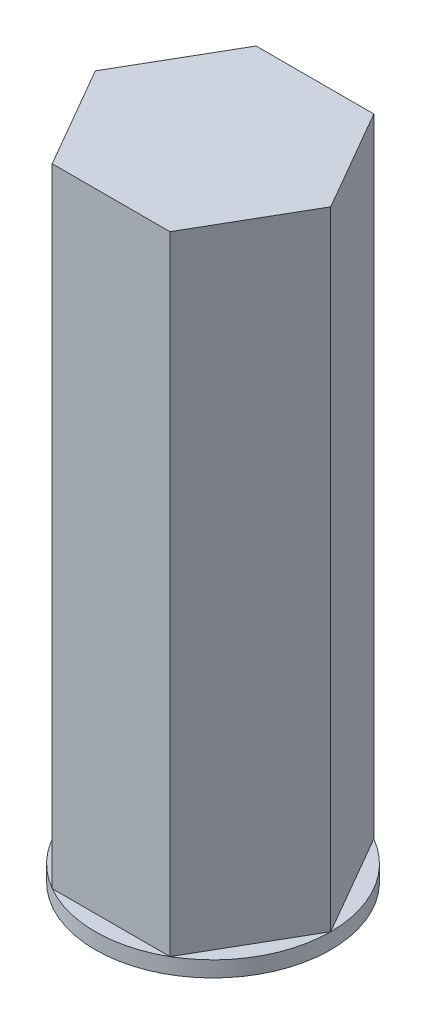
ISO-10303-21;
HEADER;
FILE_DESCRIPTION(('STEP AP214'),'2;1');
FILE_NAME('part.step','',(''),(''),'','','');
FILE_SCHEMA(('AUTOMOTIVE_DESIGN { 1 0 10303 214 1 1 1 1 }'));
ENDSEC;
DATA;
#1=APPLICATION_CONTEXT('core data for automotive mechanical design processes');
#2=APPLICATION_PROTOCOL_DEFINITION('international standard','automotive_design',2000,#1);
#3=PRODUCT_CONTEXT('',#1,'mechanical');
#4=PRODUCT('Part','Part','',(#3));
#5=PRODUCT_RELATED_PRODUCT_CATEGORY('part','',(#4));
#6=PRODUCT_DEFINITION_FORMATION('','',#4);
#7=PRODUCT_DEFINITION_CONTEXT('part definition',#1,'design');
#8=PRODUCT_DEFINITION('design','',#6,#7);
#9=PRODUCT_DEFINITION_SHAPE('','',#8);
#10=(LENGTH_UNIT() NAMED_UNIT(*) SI_UNIT(.MILLI.,.METRE.));
#11=(NAMED_UNIT(*) PLANE_ANGLE_UNIT() SI_UNIT($,.RADIAN.));
#12=(NAMED_UNIT(*) SI_UNIT($,.STERADIAN.) SOLID_ANGLE_UNIT());
#13=UNCERTAINTY_MEASURE_WITH_UNIT(LENGTH_MEASURE(1.E-05),#10,'distance_accuracy_value','');
#14=(GEOMETRIC_REPRESENTATION_CONTEXT(3) GLOBAL_UNCERTAINTY_ASSIGNED_CONTEXT((#13)) GLOBAL_UNIT_ASSIGNED_CONTEXT((#10,
#11,#12)) REPRESENTATION_CONTEXT('',''));
#15=CARTESIAN_POINT('',(0.,0.,0.));
#16=DIRECTION('',(0.,0.,1.));
#17=DIRECTION('',(1.,0.,0.));
#18=AXIS2_PLACEMENT_3D('',#15,#16,#17);
#19=CARTESIAN_POINT('',(0.,1.,0.));
#20=DIRECTION('',(0.,1.,0.));
#21=DIRECTION('',(0.,0.,1.));
#22=AXIS2_PLACEMENT_3D('',#19,#20,#21);
#23=PLANE('',#22);
#24=DIRECTION('',(0.499999999999995,0.,-0.866025403784442));
#25=VECTOR('',#24,1.);
#26=CARTESIAN_POINT('',(3.75000000000008,1.,6.49519052838324));
#27=LINE('',#26,#25);
#28=CARTESIAN_POINT('',(3.75000000000008,1.,6.49519052838324));
#29=VERTEX_POINT('',#28);
#30=CARTESIAN_POINT('',(7.5,1.,0.));
#31=VERTEX_POINT('',#30);
#32=EDGE_CURVE('E117',#29,#31,#27,.T.);
#33=ORIENTED_EDGE('',*,*,#32,.F.);
#34=CARTESIAN_POINT('',(0.,1.,0.));
#35=DIRECTION('',(0.,1.,0.));
#36=DIRECTION('',(0.,0.,1.));
#37=AXIS2_PLACEMENT_3D('',#34,#35,#36);
#38=CIRCLE('',#37,7.5);
#39=EDGE_CURVE('E11',#29,#31,#38,.T.);
#40=ORIENTED_EDGE('',*,*,#39,.T.);
#41=EDGE_LOOP('',(#33,#40));
#42=FACE_BOUND('',#41,.T.);
#43=ADVANCED_FACE('F39',(#42),#23,.T.);
#44=DIRECTION('',(1.,0.,0.));
#45=VECTOR('',#44,1.);
#46=CARTESIAN_POINT('',(-3.74999999999994,1.,6.49519052838332));
#47=LINE('',#46,#45);
#48=CARTESIAN_POINT('',(-3.74999999999994,1.,6.49519052838332));
#49=VERTEX_POINT('',#48);
#50=EDGE_CURVE('E54',#49,#29,#47,.T.);
#51=ORIENTED_EDGE('',*,*,#50,.F.);
#52=EDGE_CURVE('E47',#49,#29,#38,.T.);
#53=ORIENTED_EDGE('',*,*,#52,.T.);
#54=EDGE_LOOP('',(#51,#53));
#55=FACE_BOUND('',#54,.T.);
#56=ADVANCED_FACE('F174',(#55),#23,.T.);
#57=DIRECTION('',(0.500000000000007,0.,0.866025403784435));
#58=VECTOR('',#57,1.);
#59=CARTESIAN_POINT('',(-7.5,1.,0.));
#60=LINE('',#59,#58);
#61=CARTESIAN_POINT('',(-7.5,1.,0.));
#62=VERTEX_POINT('',#61);
#63=EDGE_CURVE('E65',#62,#49,#60,.T.);
#64=ORIENTED_EDGE('',*,*,#63,.F.);
#65=EDGE_CURVE('E206',#62,#49,#38,.T.);
#66=ORIENTED_EDGE('',*,*,#65,.T.);
#67=EDGE_LOOP('',(#64,#66));
#68=FACE_BOUND('',#67,.T.);
#69=ADVANCED_FACE('F185',(#68),#23,.T.);
#70=DIRECTION('',(-0.499999999999995,0.,0.866025403784442));
#71=VECTOR('',#70,1.);
#72=CARTESIAN_POINT('',(-3.75000000000003,1.,-6.49519052838327));
#73=LINE('',#72,#71);
#74=CARTESIAN_POINT('',(-3.75000000000003,1.,-6.49519052838327));
#75=VERTEX_POINT('',#74);
#76=EDGE_CURVE('E140',#75,#62,#73,.T.);
#77=ORIENTED_EDGE('',*,*,#76,.F.);
#78=EDGE_CURVE('E207',#75,#62,#38,.T.);
#79=ORIENTED_EDGE('',*,*,#78,.T.);
#80=EDGE_LOOP('',(#77,#79));
#81=FACE_BOUND('',#80,.T.);
#82=ADVANCED_FACE('F193',(#81),#23,.T.);
#83=DIRECTION('',(-1.,0.,0.));
#84=VECTOR('',#83,1.);
#85=CARTESIAN_POINT('',(3.74999999999998,1.,-6.4951905283833));
#86=LINE('',#85,#84);
#87=CARTESIAN_POINT('',(3.74999999999998,1.,-6.4951905283833));
#88=VERTEX_POINT('',#87);
#89=EDGE_CURVE('E139',#88,#75,#86,.T.);
#90=ORIENTED_EDGE('',*,*,#89,.F.);
#91=EDGE_CURVE('E201',#88,#75,#38,.T.);
#92=ORIENTED_EDGE('',*,*,#91,.T.);
#93=EDGE_LOOP('',(#90,#92));
#94=FACE_BOUND('',#93,.T.);
#95=ADVANCED_FACE('F190',(#94),#23,.T.);
#96=CARTESIAN_POINT('',(0.,1.,0.));
#97=DIRECTION('',(0.,-1.,0.));
#98=DIRECTION('',(0.,0.,-1.));
#99=AXIS2_PLACEMENT_3D('',#96,#97,#98);
#100=CYLINDRICAL_SURFACE('',#99,7.5);
#101=ORIENTED_EDGE('',*,*,#39,.F.);
#102=ORIENTED_EDGE('',*,*,#52,.F.);
#103=ORIENTED_EDGE('',*,*,#65,.F.);
#104=ORIENTED_EDGE('',*,*,#78,.F.);
#105=ORIENTED_EDGE('',*,*,#91,.F.);
#106=EDGE_CURVE('E48',#31,#88,#38,.T.);
#107=ORIENTED_EDGE('',*,*,#106,.F.);
#108=EDGE_LOOP('',(#101,#102,#103,#104,#105,#107));
#109=FACE_BOUND('',#108,.T.);
#110=CARTESIAN_POINT('',(0.,0.,0.));
#111=DIRECTION('',(0.,1.,0.));
#112=DIRECTION('',(0.,0.,1.));
#113=AXIS2_PLACEMENT_3D('',#110,#111,#112);
#114=CIRCLE('',#113,7.5);
#115=CARTESIAN_POINT('',(0.,0.,7.5));
#116=VERTEX_POINT('',#115);
#117=EDGE_CURVE('E43',#116,#116,#114,.T.);
#118=ORIENTED_EDGE('',*,*,#117,.T.);
#119=EDGE_LOOP('',(#118));
#120=FACE_BOUND('',#119,.T.);
#121=ADVANCED_FACE('F41',(#109,#120),#100,.T.);
#122=DIRECTION('',(-0.500000000000001,0.,-0.866025403784438));
#123=VECTOR('',#122,1.);
#124=CARTESIAN_POINT('',(7.5,1.,0.));
#125=LINE('',#124,#123);
#126=EDGE_CURVE('E142',#31,#88,#125,.T.);
#127=ORIENTED_EDGE('',*,*,#126,.F.);
#128=ORIENTED_EDGE('',*,*,#106,.T.);
#129=EDGE_LOOP('',(#127,#128));
#130=FACE_BOUND('',#129,.T.);
#131=ADVANCED_FACE('F180',(#130),#23,.T.);
#132=CARTESIAN_POINT('',(0.,0.,0.));
#133=DIRECTION('',(0.,1.,0.));
#134=DIRECTION('',(0.,0.,1.));
#135=AXIS2_PLACEMENT_3D('',#132,#133,#134);
#136=PLANE('',#135);
#137=ORIENTED_EDGE('',*,*,#117,.F.);
#138=EDGE_LOOP('',(#137));
#139=FACE_BOUND('',#138,.T.);
#140=ADVANCED_FACE('F184',(#139),#136,.F.);
#141=CARTESIAN_POINT('',(3.75000000000008,41.,6.49519052838324));
#142=DIRECTION('',(-0.866025403784442,0.,-0.499999999999995));
#143=DIRECTION('',(-0.499999999999995,0.,0.866025403784442));
#144=AXIS2_PLACEMENT_3D('',#141,#142,#143);
#145=PLANE('',#144);
#146=ORIENTED_EDGE('',*,*,#32,.T.);
#147=DIRECTION('',(0.,-1.,0.));
#148=VECTOR('',#147,1.);
#149=CARTESIAN_POINT('',(7.5,41.,0.));
#150=LINE('',#149,#148);
#151=CARTESIAN_POINT('',(7.5,41.,0.));
#152=VERTEX_POINT('',#151);
#153=EDGE_CURVE('E102',#152,#31,#150,.T.);
#154=ORIENTED_EDGE('',*,*,#153,.F.);
#155=DIRECTION('',(0.499999999999995,0.,-0.866025403784442));
#156=VECTOR('',#155,1.);
#157=CARTESIAN_POINT('',(3.75000000000008,41.,6.49519052838324));
#158=LINE('',#157,#156);
#159=CARTESIAN_POINT('',(3.75000000000008,41.,6.49519052838324));
#160=VERTEX_POINT('',#159);
#161=EDGE_CURVE('E106',#160,#152,#158,.T.);
#162=ORIENTED_EDGE('',*,*,#161,.F.);
#163=DIRECTION('',(0.,-1.,0.));
#164=VECTOR('',#163,1.);
#165=CARTESIAN_POINT('',(3.75000000000008,41.,6.49519052838324));
#166=LINE('',#165,#164);
#167=EDGE_CURVE('E133',#160,#29,#166,.T.);
#168=ORIENTED_EDGE('',*,*,#167,.T.);
#169=EDGE_LOOP('',(#146,#154,#162,#168));
#170=FACE_BOUND('',#169,.T.);
#171=ADVANCED_FACE('F116',(#170),#145,.F.);
#172=CARTESIAN_POINT('',(7.5,41.,0.));
#173=DIRECTION('',(-0.866025403784438,0.,0.500000000000001));
#174=DIRECTION('',(0.500000000000001,0.,0.866025403784438));
#175=AXIS2_PLACEMENT_3D('',#172,#173,#174);
#176=PLANE('',#175);
#177=ORIENTED_EDGE('',*,*,#126,.T.);
#178=DIRECTION('',(0.,-1.,0.));
#179=VECTOR('',#178,1.);
#180=CARTESIAN_POINT('',(3.74999999999998,41.,-6.4951905283833));
#181=LINE('',#180,#179);
#182=CARTESIAN_POINT('',(3.74999999999998,41.,-6.4951905283833));
#183=VERTEX_POINT('',#182);
#184=EDGE_CURVE('E101',#183,#88,#181,.T.);
#185=ORIENTED_EDGE('',*,*,#184,.F.);
#186=DIRECTION('',(-0.500000000000001,0.,-0.866025403784438));
#187=VECTOR('',#186,1.);
#188=CARTESIAN_POINT('',(7.5,41.,0.));
#189=LINE('',#188,#187);
#190=EDGE_CURVE('E96',#152,#183,#189,.T.);
#191=ORIENTED_EDGE('',*,*,#190,.F.);
#192=ORIENTED_EDGE('',*,*,#153,.T.);
#193=EDGE_LOOP('',(#177,#185,#191,#192));
#194=FACE_BOUND('',#193,.T.);
#195=ADVANCED_FACE('F98',(#194),#176,.F.);
#196=CARTESIAN_POINT('',(3.74999999999998,41.,-6.4951905283833));
#197=DIRECTION('',(0.,0.,1.));
#198=DIRECTION('',(1.,0.,0.));
#199=AXIS2_PLACEMENT_3D('',#196,#197,#198);
#200=PLANE('',#199);
#201=ORIENTED_EDGE('',*,*,#89,.T.);
#202=DIRECTION('',(0.,-1.,0.));
#203=VECTOR('',#202,1.);
#204=CARTESIAN_POINT('',(-3.75000000000003,41.,-6.49519052838327));
#205=LINE('',#204,#203);
#206=CARTESIAN_POINT('',(-3.75000000000003,41.,-6.49519052838327));
#207=VERTEX_POINT('',#206);
#208=EDGE_CURVE('E122',#207,#75,#205,.T.);
#209=ORIENTED_EDGE('',*,*,#208,.F.);
#210=DIRECTION('',(-1.,0.,0.));
#211=VECTOR('',#210,1.);
#212=CARTESIAN_POINT('',(3.74999999999998,41.,-6.4951905283833));
#213=LINE('',#212,#211);
#214=EDGE_CURVE('E110',#183,#207,#213,.T.);
#215=ORIENTED_EDGE('',*,*,#214,.F.);
#216=ORIENTED_EDGE('',*,*,#184,.T.);
#217=EDGE_LOOP('',(#201,#209,#215,#216));
#218=FACE_BOUND('',#217,.T.);
#219=ADVANCED_FACE('F154',(#218),#200,.F.);
#220=CARTESIAN_POINT('',(-3.75000000000003,41.,-6.49519052838327));
#221=DIRECTION('',(0.866025403784442,0.,0.499999999999995));
#222=DIRECTION('',(0.499999999999995,0.,-0.866025403784441));
#223=AXIS2_PLACEMENT_3D('',#220,#221,#222);
#224=PLANE('',#223);
#225=ORIENTED_EDGE('',*,*,#76,.T.);
#226=DIRECTION('',(0.,-1.,0.));
#227=VECTOR('',#226,1.);
#228=CARTESIAN_POINT('',(-7.5,41.,0.));
#229=LINE('',#228,#227);
#230=CARTESIAN_POINT('',(-7.5,41.,0.));
#231=VERTEX_POINT('',#230);
#232=EDGE_CURVE('E130',#231,#62,#229,.T.);
#233=ORIENTED_EDGE('',*,*,#232,.F.);
#234=DIRECTION('',(-0.499999999999995,0.,0.866025403784442));
#235=VECTOR('',#234,1.);
#236=CARTESIAN_POINT('',(-3.75000000000003,41.,-6.49519052838327));
#237=LINE('',#236,#235);
#238=EDGE_CURVE('E146',#207,#231,#237,.T.);
#239=ORIENTED_EDGE('',*,*,#238,.F.);
#240=ORIENTED_EDGE('',*,*,#208,.T.);
#241=EDGE_LOOP('',(#225,#233,#239,#240));
#242=FACE_BOUND('',#241,.T.);
#243=ADVANCED_FACE('F156',(#242),#224,.F.);
#244=CARTESIAN_POINT('',(-7.5,41.,0.));
#245=DIRECTION('',(0.866025403784435,0.,-0.500000000000007));
#246=DIRECTION('',(-0.500000000000007,0.,-0.866025403784435));
#247=AXIS2_PLACEMENT_3D('',#244,#245,#246);
#248=PLANE('',#247);
#249=ORIENTED_EDGE('',*,*,#63,.T.);
#250=DIRECTION('',(0.,-1.,0.));
#251=VECTOR('',#250,1.);
#252=CARTESIAN_POINT('',(-3.74999999999994,41.,6.49519052838332));
#253=LINE('',#252,#251);
#254=CARTESIAN_POINT('',(-3.74999999999994,41.,6.49519052838332));
#255=VERTEX_POINT('',#254);
#256=EDGE_CURVE('E127',#255,#49,#253,.T.);
#257=ORIENTED_EDGE('',*,*,#256,.F.);
#258=DIRECTION('',(0.500000000000007,0.,0.866025403784435));
#259=VECTOR('',#258,1.);
#260=CARTESIAN_POINT('',(-7.5,41.,0.));
#261=LINE('',#260,#259);
#262=EDGE_CURVE('E150',#231,#255,#261,.T.);
#263=ORIENTED_EDGE('',*,*,#262,.F.);
#264=ORIENTED_EDGE('',*,*,#232,.T.);
#265=EDGE_LOOP('',(#249,#257,#263,#264));
#266=FACE_BOUND('',#265,.T.);
#267=ADVANCED_FACE('F165',(#266),#248,.F.);
#268=CARTESIAN_POINT('',(-3.74999999999994,41.,6.49519052838332));
#269=DIRECTION('',(0.,0.,-1.));
#270=DIRECTION('',(-1.,0.,0.));
#271=AXIS2_PLACEMENT_3D('',#268,#269,#270);
#272=PLANE('',#271);
#273=ORIENTED_EDGE('',*,*,#50,.T.);
#274=ORIENTED_EDGE('',*,*,#167,.F.);
#275=DIRECTION('',(1.,0.,0.));
#276=VECTOR('',#275,1.);
#277=CARTESIAN_POINT('',(-3.74999999999994,41.,6.49519052838332));
#278=LINE('',#277,#276);
#279=EDGE_CURVE('E111',#255,#160,#278,.T.);
#280=ORIENTED_EDGE('',*,*,#279,.F.);
#281=ORIENTED_EDGE('',*,*,#256,.T.);
#282=EDGE_LOOP('',(#273,#274,#280,#281));
#283=FACE_BOUND('',#282,.T.);
#284=ADVANCED_FACE('F162',(#283),#272,.F.);
#285=CARTESIAN_POINT('',(0.,41.,0.));
#286=DIRECTION('',(0.,1.,0.));
#287=DIRECTION('',(0.,0.,1.));
#288=AXIS2_PLACEMENT_3D('',#285,#286,#287);
#289=PLANE('',#288);
#290=ORIENTED_EDGE('',*,*,#161,.T.);
#291=ORIENTED_EDGE('',*,*,#190,.T.);
#292=ORIENTED_EDGE('',*,*,#214,.T.);
#293=ORIENTED_EDGE('',*,*,#238,.T.);
#294=ORIENTED_EDGE('',*,*,#262,.T.);
#295=ORIENTED_EDGE('',*,*,#279,.T.);
#296=EDGE_LOOP('',(#290,#291,#292,#293,#294,#295));
#297=FACE_BOUND('',#296,.T.);
#298=ADVANCED_FACE('F112',(#297),#289,.T.);
#299=CLOSED_SHELL('',(#43,#56,#69,#82,#95,#121,#131,#140,#171,#195,#219,#243,#267,#284,#298));
#300=MANIFOLD_SOLID_BREP('B2',#299);
#301=ADVANCED_BREP_SHAPE_REPRESENTATION('',(#18,#300),#14);
#302=SHAPE_DEFINITION_REPRESENTATION(#9,#301);
ENDSEC;
END-ISO-10303-21;
